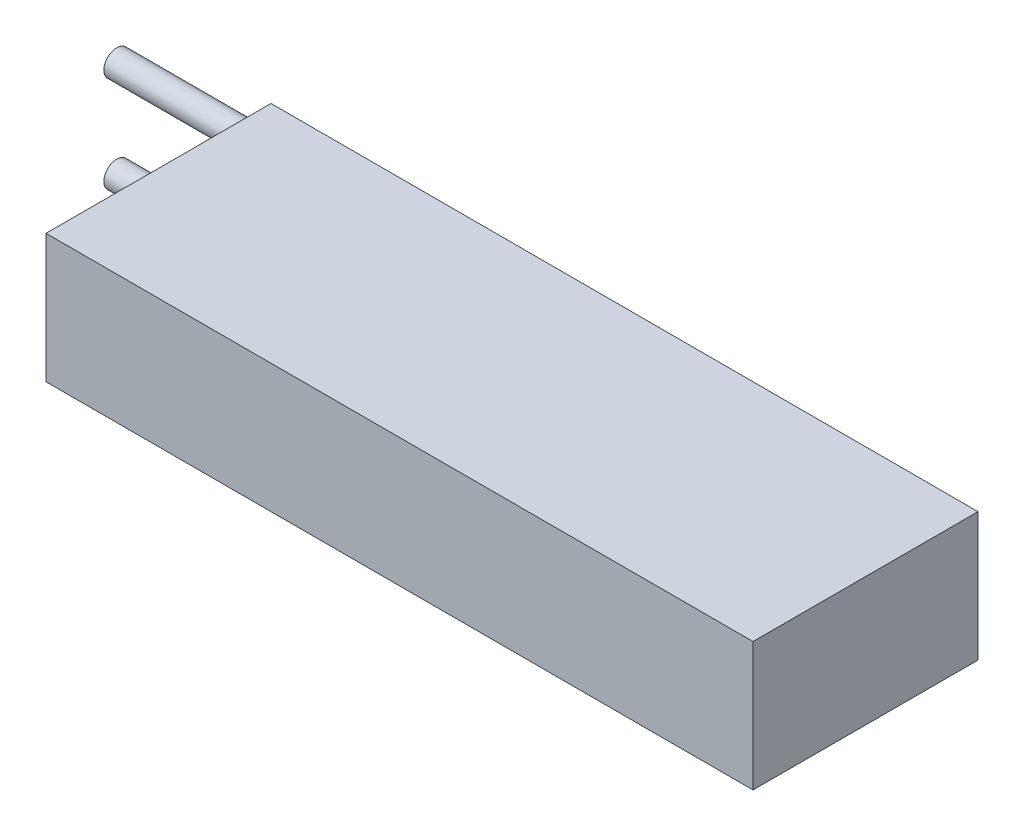
ISO-10303-21;
HEADER;
FILE_DESCRIPTION(('STEP AP214'),'2;1');
FILE_NAME('part.step','',(''),(''),'','','');
FILE_SCHEMA(('AUTOMOTIVE_DESIGN { 1 0 10303 214 1 1 1 1 }'));
ENDSEC;
DATA;
#1=APPLICATION_CONTEXT('core data for automotive mechanical design processes');
#2=APPLICATION_PROTOCOL_DEFINITION('international standard','automotive_design',2000,#1);
#3=PRODUCT_CONTEXT('',#1,'mechanical');
#4=PRODUCT('Part','Part','',(#3));
#5=PRODUCT_RELATED_PRODUCT_CATEGORY('part','',(#4));
#6=PRODUCT_DEFINITION_FORMATION('','',#4);
#7=PRODUCT_DEFINITION_CONTEXT('part definition',#1,'design');
#8=PRODUCT_DEFINITION('design','',#6,#7);
#9=PRODUCT_DEFINITION_SHAPE('','',#8);
#10=(LENGTH_UNIT() NAMED_UNIT(*) SI_UNIT(.MILLI.,.METRE.));
#11=(NAMED_UNIT(*) PLANE_ANGLE_UNIT() SI_UNIT($,.RADIAN.));
#12=(NAMED_UNIT(*) SI_UNIT($,.STERADIAN.) SOLID_ANGLE_UNIT());
#13=UNCERTAINTY_MEASURE_WITH_UNIT(LENGTH_MEASURE(1.E-05),#10,'distance_accuracy_value','');
#14=(GEOMETRIC_REPRESENTATION_CONTEXT(3) GLOBAL_UNCERTAINTY_ASSIGNED_CONTEXT((#13)) GLOBAL_UNIT_ASSIGNED_CONTEXT((#10,
#11,#12)) REPRESENTATION_CONTEXT('',''));
#15=CARTESIAN_POINT('',(0.,0.,0.));
#16=DIRECTION('',(0.,0.,1.));
#17=DIRECTION('',(1.,0.,0.));
#18=AXIS2_PLACEMENT_3D('',#15,#16,#17);
#19=CARTESIAN_POINT('',(0.,20.,0.));
#20=DIRECTION('',(1.,0.,0.));
#21=DIRECTION('',(0.,0.,-1.));
#22=AXIS2_PLACEMENT_3D('',#19,#20,#21);
#23=PLANE('',#22);
#24=CARTESIAN_POINT('',(0.,2.5,-31.));
#25=DIRECTION('',(1.,0.,0.));
#26=DIRECTION('',(0.,0.,-1.));
#27=AXIS2_PLACEMENT_3D('',#24,#25,#26);
#28=CIRCLE('',#27,2.);
#29=CARTESIAN_POINT('',(0.,2.5,-33.));
#30=VERTEX_POINT('',#29);
#31=EDGE_CURVE('E13',#30,#30,#28,.F.);
#32=ORIENTED_EDGE('',*,*,#31,.F.);
#33=EDGE_LOOP('',(#32));
#34=FACE_BOUND('',#33,.T.);
#35=CARTESIAN_POINT('',(0.,17.5,-31.));
#36=DIRECTION('',(1.,0.,0.));
#37=DIRECTION('',(0.,0.,-1.));
#38=AXIS2_PLACEMENT_3D('',#35,#36,#37);
#39=CIRCLE('',#38,2.);
#40=CARTESIAN_POINT('',(0.,17.5,-33.));
#41=VERTEX_POINT('',#40);
#42=EDGE_CURVE('E52',#41,#41,#39,.F.);
#43=ORIENTED_EDGE('',*,*,#42,.F.);
#44=EDGE_LOOP('',(#43));
#45=FACE_BOUND('',#44,.T.);
#46=DIRECTION('',(0.,0.,1.));
#47=VECTOR('',#46,1.);
#48=CARTESIAN_POINT('',(0.,0.,0.));
#49=LINE('',#48,#47);
#50=CARTESIAN_POINT('',(0.,0.,-35.));
#51=VERTEX_POINT('',#50);
#52=CARTESIAN_POINT('',(0.,0.,0.));
#53=VERTEX_POINT('',#52);
#54=EDGE_CURVE('E111',#51,#53,#49,.T.);
#55=ORIENTED_EDGE('',*,*,#54,.T.);
#56=DIRECTION('',(0.,-1.,0.));
#57=VECTOR('',#56,1.);
#58=CARTESIAN_POINT('',(0.,20.,0.));
#59=LINE('',#58,#57);
#60=CARTESIAN_POINT('',(0.,20.,0.));
#61=VERTEX_POINT('',#60);
#62=EDGE_CURVE('E102',#61,#53,#59,.T.);
#63=ORIENTED_EDGE('',*,*,#62,.F.);
#64=DIRECTION('',(0.,0.,1.));
#65=VECTOR('',#64,1.);
#66=CARTESIAN_POINT('',(0.,20.,0.));
#67=LINE('',#66,#65);
#68=CARTESIAN_POINT('',(0.,20.,-35.));
#69=VERTEX_POINT('',#68);
#70=EDGE_CURVE('E96',#69,#61,#67,.T.);
#71=ORIENTED_EDGE('',*,*,#70,.F.);
#72=DIRECTION('',(0.,-1.,0.));
#73=VECTOR('',#72,1.);
#74=CARTESIAN_POINT('',(0.,20.,-35.));
#75=LINE('',#74,#73);
#76=EDGE_CURVE('E107',#69,#51,#75,.T.);
#77=ORIENTED_EDGE('',*,*,#76,.T.);
#78=EDGE_LOOP('',(#55,#63,#71,#77));
#79=FACE_BOUND('',#78,.T.);
#80=ADVANCED_FACE('F44',(#34,#45,#79),#23,.F.);
#81=CARTESIAN_POINT('',(0.,20.,0.));
#82=DIRECTION('',(0.,0.,-1.));
#83=DIRECTION('',(-1.,0.,0.));
#84=AXIS2_PLACEMENT_3D('',#81,#82,#83);
#85=PLANE('',#84);
#86=DIRECTION('',(1.,0.,0.));
#87=VECTOR('',#86,1.);
#88=CARTESIAN_POINT('',(0.,0.,0.));
#89=LINE('',#88,#87);
#90=CARTESIAN_POINT('',(110.,0.,0.));
#91=VERTEX_POINT('',#90);
#92=EDGE_CURVE('E101',#53,#91,#89,.T.);
#93=ORIENTED_EDGE('',*,*,#92,.T.);
#94=DIRECTION('',(0.,-1.,0.));
#95=VECTOR('',#94,1.);
#96=CARTESIAN_POINT('',(110.,20.,0.));
#97=LINE('',#96,#95);
#98=CARTESIAN_POINT('',(110.,20.,0.));
#99=VERTEX_POINT('',#98);
#100=EDGE_CURVE('E99',#99,#91,#97,.T.);
#101=ORIENTED_EDGE('',*,*,#100,.F.);
#102=DIRECTION('',(1.,0.,0.));
#103=VECTOR('',#102,1.);
#104=CARTESIAN_POINT('',(0.,20.,0.));
#105=LINE('',#104,#103);
#106=EDGE_CURVE('E91',#61,#99,#105,.T.);
#107=ORIENTED_EDGE('',*,*,#106,.F.);
#108=ORIENTED_EDGE('',*,*,#62,.T.);
#109=EDGE_LOOP('',(#93,#101,#107,#108));
#110=FACE_BOUND('',#109,.T.);
#111=ADVANCED_FACE('F100',(#110),#85,.F.);
#112=CARTESIAN_POINT('',(110.,20.,0.));
#113=DIRECTION('',(-1.,0.,0.));
#114=DIRECTION('',(0.,0.,1.));
#115=AXIS2_PLACEMENT_3D('',#112,#113,#114);
#116=PLANE('',#115);
#117=DIRECTION('',(0.,0.,-1.));
#118=VECTOR('',#117,1.);
#119=CARTESIAN_POINT('',(110.,0.,0.));
#120=LINE('',#119,#118);
#121=CARTESIAN_POINT('',(110.,0.,-35.));
#122=VERTEX_POINT('',#121);
#123=EDGE_CURVE('E77',#91,#122,#120,.T.);
#124=ORIENTED_EDGE('',*,*,#123,.T.);
#125=DIRECTION('',(0.,-1.,0.));
#126=VECTOR('',#125,1.);
#127=CARTESIAN_POINT('',(110.,20.,-35.));
#128=LINE('',#127,#126);
#129=CARTESIAN_POINT('',(110.,20.,-35.));
#130=VERTEX_POINT('',#129);
#131=EDGE_CURVE('E103',#130,#122,#128,.T.);
#132=ORIENTED_EDGE('',*,*,#131,.F.);
#133=DIRECTION('',(0.,0.,-1.));
#134=VECTOR('',#133,1.);
#135=CARTESIAN_POINT('',(110.,20.,0.));
#136=LINE('',#135,#134);
#137=EDGE_CURVE('E94',#99,#130,#136,.T.);
#138=ORIENTED_EDGE('',*,*,#137,.F.);
#139=ORIENTED_EDGE('',*,*,#100,.T.);
#140=EDGE_LOOP('',(#124,#132,#138,#139));
#141=FACE_BOUND('',#140,.T.);
#142=ADVANCED_FACE('F105',(#141),#116,.F.);
#143=CARTESIAN_POINT('',(0.,20.,-35.));
#144=DIRECTION('',(0.,0.,1.));
#145=DIRECTION('',(1.,0.,0.));
#146=AXIS2_PLACEMENT_3D('',#143,#144,#145);
#147=PLANE('',#146);
#148=DIRECTION('',(-1.,0.,0.));
#149=VECTOR('',#148,1.);
#150=CARTESIAN_POINT('',(0.,0.,-35.));
#151=LINE('',#150,#149);
#152=EDGE_CURVE('E83',#122,#51,#151,.T.);
#153=ORIENTED_EDGE('',*,*,#152,.T.);
#154=ORIENTED_EDGE('',*,*,#76,.F.);
#155=DIRECTION('',(-1.,0.,0.));
#156=VECTOR('',#155,1.);
#157=CARTESIAN_POINT('',(0.,20.,-35.));
#158=LINE('',#157,#156);
#159=EDGE_CURVE('E60',#130,#69,#158,.T.);
#160=ORIENTED_EDGE('',*,*,#159,.F.);
#161=ORIENTED_EDGE('',*,*,#131,.T.);
#162=EDGE_LOOP('',(#153,#154,#160,#161));
#163=FACE_BOUND('',#162,.T.);
#164=ADVANCED_FACE('F140',(#163),#147,.F.);
#165=CARTESIAN_POINT('',(0.,20.,0.));
#166=DIRECTION('',(0.,-1.,0.));
#167=DIRECTION('',(0.,0.,-1.));
#168=AXIS2_PLACEMENT_3D('',#165,#166,#167);
#169=PLANE('',#168);
#170=ORIENTED_EDGE('',*,*,#70,.T.);
#171=ORIENTED_EDGE('',*,*,#106,.T.);
#172=ORIENTED_EDGE('',*,*,#137,.T.);
#173=ORIENTED_EDGE('',*,*,#159,.T.);
#174=EDGE_LOOP('',(#170,#171,#172,#173));
#175=FACE_BOUND('',#174,.T.);
#176=ADVANCED_FACE('F92',(#175),#169,.F.);
#177=CARTESIAN_POINT('',(0.,0.,0.));
#178=DIRECTION('',(0.,-1.,0.));
#179=DIRECTION('',(0.,0.,-1.));
#180=AXIS2_PLACEMENT_3D('',#177,#178,#179);
#181=PLANE('',#180);
#182=ORIENTED_EDGE('',*,*,#54,.F.);
#183=ORIENTED_EDGE('',*,*,#152,.F.);
#184=ORIENTED_EDGE('',*,*,#123,.F.);
#185=ORIENTED_EDGE('',*,*,#92,.F.);
#186=EDGE_LOOP('',(#182,#183,#184,#185));
#187=FACE_BOUND('',#186,.T.);
#188=ADVANCED_FACE('F130',(#187),#181,.T.);
#189=CARTESIAN_POINT('',(-20.,17.5,-31.));
#190=DIRECTION('',(1.,0.,0.));
#191=DIRECTION('',(0.,0.,-1.));
#192=AXIS2_PLACEMENT_3D('',#189,#190,#191);
#193=CYLINDRICAL_SURFACE('',#192,2.);
#194=CARTESIAN_POINT('',(-20.,17.5,-31.));
#195=DIRECTION('',(-1.,0.,0.));
#196=DIRECTION('',(0.,0.,1.));
#197=AXIS2_PLACEMENT_3D('',#194,#195,#196);
#198=CIRCLE('',#197,2.);
#199=CARTESIAN_POINT('',(-20.,17.5,-29.));
#200=VERTEX_POINT('',#199);
#201=EDGE_CURVE('E114',#200,#200,#198,.T.);
#202=ORIENTED_EDGE('',*,*,#201,.F.);
#203=EDGE_LOOP('',(#202));
#204=FACE_BOUND('',#203,.T.);
#205=ORIENTED_EDGE('',*,*,#42,.T.);
#206=EDGE_LOOP('',(#205));
#207=FACE_BOUND('',#206,.T.);
#208=ADVANCED_FACE('F123',(#204,#207),#193,.T.);
#209=CARTESIAN_POINT('',(-20.,17.5,-31.));
#210=DIRECTION('',(-1.,0.,0.));
#211=DIRECTION('',(0.,0.,1.));
#212=AXIS2_PLACEMENT_3D('',#209,#210,#211);
#213=PLANE('',#212);
#214=ORIENTED_EDGE('',*,*,#201,.T.);
#215=EDGE_LOOP('',(#214));
#216=FACE_BOUND('',#215,.T.);
#217=ADVANCED_FACE('F137',(#216),#213,.T.);
#218=CARTESIAN_POINT('',(-20.,2.5,-31.));
#219=DIRECTION('',(1.,0.,0.));
#220=DIRECTION('',(0.,0.,-1.));
#221=AXIS2_PLACEMENT_3D('',#218,#219,#220);
#222=CYLINDRICAL_SURFACE('',#221,2.);
#223=CARTESIAN_POINT('',(-20.,2.5,-31.));
#224=DIRECTION('',(-1.,0.,0.));
#225=DIRECTION('',(0.,0.,1.));
#226=AXIS2_PLACEMENT_3D('',#223,#224,#225);
#227=CIRCLE('',#226,2.);
#228=CARTESIAN_POINT('',(-20.,2.5,-29.));
#229=VERTEX_POINT('',#228);
#230=EDGE_CURVE('E212',#229,#229,#227,.T.);
#231=ORIENTED_EDGE('',*,*,#230,.F.);
#232=EDGE_LOOP('',(#231));
#233=FACE_BOUND('',#232,.T.);
#234=ORIENTED_EDGE('',*,*,#31,.T.);
#235=EDGE_LOOP('',(#234));
#236=FACE_BOUND('',#235,.T.);
#237=ADVANCED_FACE('F186',(#233,#236),#222,.T.);
#238=CARTESIAN_POINT('',(-20.,2.5,-31.));
#239=DIRECTION('',(-1.,0.,0.));
#240=DIRECTION('',(0.,0.,1.));
#241=AXIS2_PLACEMENT_3D('',#238,#239,#240);
#242=PLANE('',#241);
#243=ORIENTED_EDGE('',*,*,#230,.T.);
#244=EDGE_LOOP('',(#243));
#245=FACE_BOUND('',#244,.T.);
#246=ADVANCED_FACE('F196',(#245),#242,.T.);
#247=CLOSED_SHELL('',(#80,#111,#142,#164,#176,#188,#208,#217,#237,#246));
#248=MANIFOLD_SOLID_BREP('B2',#247);
#249=ADVANCED_BREP_SHAPE_REPRESENTATION('',(#18,#248),#14);
#250=SHAPE_DEFINITION_REPRESENTATION(#9,#249);
ENDSEC;
END-ISO-10303-21;
